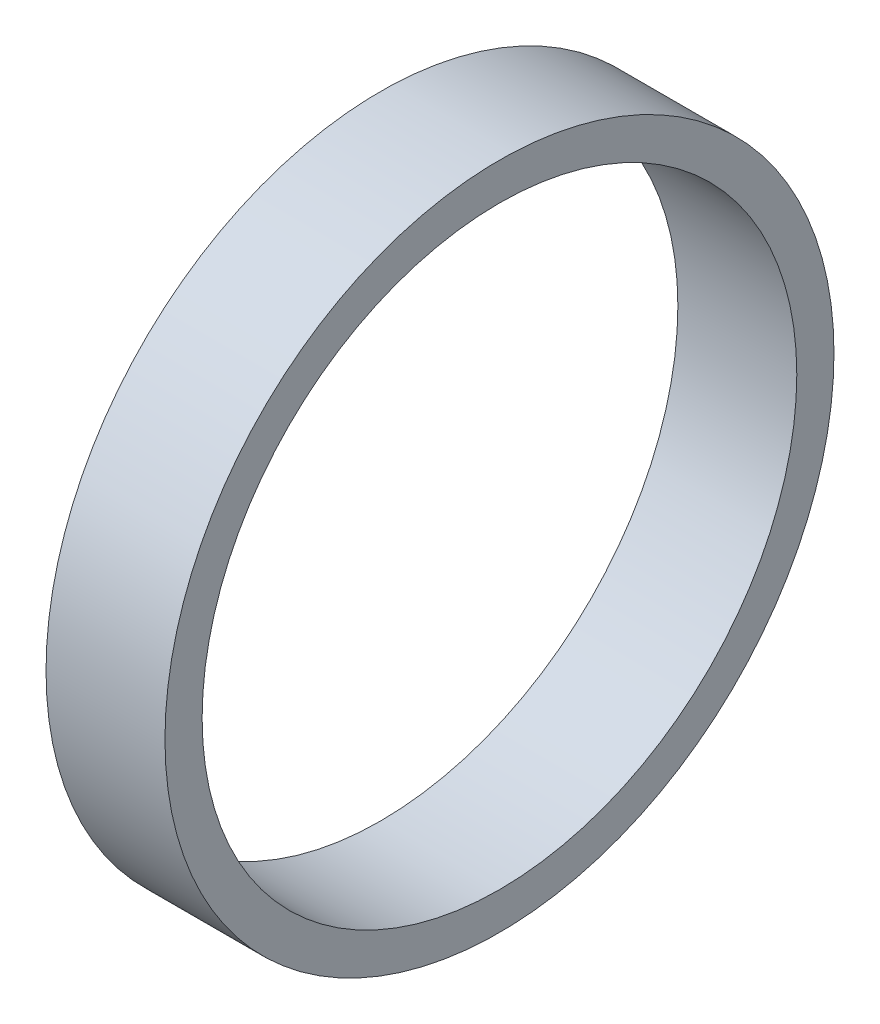
ISO-10303-21;
HEADER;
FILE_DESCRIPTION(('STEP AP214'),'2;1');
FILE_NAME('part.step','',(''),(''),'','','');
FILE_SCHEMA(('AUTOMOTIVE_DESIGN { 1 0 10303 214 1 1 1 1 }'));
ENDSEC;
DATA;
#1=APPLICATION_CONTEXT('core data for automotive mechanical design processes');
#2=APPLICATION_PROTOCOL_DEFINITION('international standard','automotive_design',2000,#1);
#3=PRODUCT_CONTEXT('',#1,'mechanical');
#4=PRODUCT('Part','Part','',(#3));
#5=PRODUCT_RELATED_PRODUCT_CATEGORY('part','',(#4));
#6=PRODUCT_DEFINITION_FORMATION('','',#4);
#7=PRODUCT_DEFINITION_CONTEXT('part definition',#1,'design');
#8=PRODUCT_DEFINITION('design','',#6,#7);
#9=PRODUCT_DEFINITION_SHAPE('','',#8);
#10=(LENGTH_UNIT() NAMED_UNIT(*) SI_UNIT(.MILLI.,.METRE.));
#11=(NAMED_UNIT(*) PLANE_ANGLE_UNIT() SI_UNIT($,.RADIAN.));
#12=(NAMED_UNIT(*) SI_UNIT($,.STERADIAN.) SOLID_ANGLE_UNIT());
#13=UNCERTAINTY_MEASURE_WITH_UNIT(LENGTH_MEASURE(1.E-05),#10,'distance_accuracy_value','');
#14=(GEOMETRIC_REPRESENTATION_CONTEXT(3) GLOBAL_UNCERTAINTY_ASSIGNED_CONTEXT((#13)) GLOBAL_UNIT_ASSIGNED_CONTEXT((#10,
#11,#12)) REPRESENTATION_CONTEXT('',''));
#15=CARTESIAN_POINT('',(0.,0.,0.));
#16=DIRECTION('',(0.,0.,1.));
#17=DIRECTION('',(1.,0.,0.));
#18=AXIS2_PLACEMENT_3D('',#15,#16,#17);
#19=CARTESIAN_POINT('',(5.08,0.,0.));
#20=DIRECTION('',(1.,0.,0.));
#21=DIRECTION('',(0.,0.,-1.));
#22=AXIS2_PLACEMENT_3D('',#19,#20,#21);
#23=PLANE('',#22);
#24=CARTESIAN_POINT('',(5.08,0.,0.));
#25=DIRECTION('',(1.,0.,0.));
#26=DIRECTION('',(0.,0.,-1.));
#27=AXIS2_PLACEMENT_3D('',#24,#25,#26);
#28=CIRCLE('',#27,14.2875);
#29=CARTESIAN_POINT('',(5.08,0.,-14.2875));
#30=VERTEX_POINT('',#29);
#31=EDGE_CURVE('E12',#30,#30,#28,.T.);
#32=ORIENTED_EDGE('',*,*,#31,.T.);
#33=EDGE_LOOP('',(#32));
#34=FACE_BOUND('',#33,.T.);
#35=CARTESIAN_POINT('',(5.08,0.,0.));
#36=DIRECTION('',(1.,0.,0.));
#37=DIRECTION('',(0.,0.,-1.));
#38=AXIS2_PLACEMENT_3D('',#35,#36,#37);
#39=CIRCLE('',#38,12.7);
#40=CARTESIAN_POINT('',(5.08,0.,-12.7));
#41=VERTEX_POINT('',#40);
#42=EDGE_CURVE('E56',#41,#41,#39,.T.);
#43=ORIENTED_EDGE('',*,*,#42,.F.);
#44=EDGE_LOOP('',(#43));
#45=FACE_BOUND('',#44,.T.);
#46=ADVANCED_FACE('F45',(#34,#45),#23,.T.);
#47=CARTESIAN_POINT('',(0.,0.,0.));
#48=DIRECTION('',(1.,0.,0.));
#49=DIRECTION('',(0.,0.,-1.));
#50=AXIS2_PLACEMENT_3D('',#47,#48,#49);
#51=PLANE('',#50);
#52=CARTESIAN_POINT('',(0.,0.,0.));
#53=DIRECTION('',(1.,0.,0.));
#54=DIRECTION('',(0.,0.,-1.));
#55=AXIS2_PLACEMENT_3D('',#52,#53,#54);
#56=CIRCLE('',#55,14.2875);
#57=CARTESIAN_POINT('',(0.,0.,-14.2875));
#58=VERTEX_POINT('',#57);
#59=EDGE_CURVE('E49',#58,#58,#56,.T.);
#60=ORIENTED_EDGE('',*,*,#59,.F.);
#61=EDGE_LOOP('',(#60));
#62=FACE_BOUND('',#61,.T.);
#63=CARTESIAN_POINT('',(0.,0.,0.));
#64=DIRECTION('',(1.,0.,0.));
#65=DIRECTION('',(0.,0.,-1.));
#66=AXIS2_PLACEMENT_3D('',#63,#64,#65);
#67=CIRCLE('',#66,12.7);
#68=CARTESIAN_POINT('',(0.,0.,-12.7));
#69=VERTEX_POINT('',#68);
#70=EDGE_CURVE('E58',#69,#69,#67,.T.);
#71=ORIENTED_EDGE('',*,*,#70,.T.);
#72=EDGE_LOOP('',(#71));
#73=FACE_BOUND('',#72,.T.);
#74=ADVANCED_FACE('F68',(#62,#73),#51,.F.);
#75=CARTESIAN_POINT('',(5.08,0.,0.));
#76=DIRECTION('',(-1.,0.,0.));
#77=DIRECTION('',(0.,0.,1.));
#78=AXIS2_PLACEMENT_3D('',#75,#76,#77);
#79=CYLINDRICAL_SURFACE('',#78,14.2875);
#80=ORIENTED_EDGE('',*,*,#31,.F.);
#81=EDGE_LOOP('',(#80));
#82=FACE_BOUND('',#81,.T.);
#83=ORIENTED_EDGE('',*,*,#59,.T.);
#84=EDGE_LOOP('',(#83));
#85=FACE_BOUND('',#84,.T.);
#86=ADVANCED_FACE('F47',(#82,#85),#79,.T.);
#87=CARTESIAN_POINT('',(5.08,0.,0.));
#88=DIRECTION('',(-1.,0.,0.));
#89=DIRECTION('',(0.,0.,1.));
#90=AXIS2_PLACEMENT_3D('',#87,#88,#89);
#91=CYLINDRICAL_SURFACE('',#90,12.7);
#92=ORIENTED_EDGE('',*,*,#42,.T.);
#93=EDGE_LOOP('',(#92));
#94=FACE_BOUND('',#93,.T.);
#95=ORIENTED_EDGE('',*,*,#70,.F.);
#96=EDGE_LOOP('',(#95));
#97=FACE_BOUND('',#96,.T.);
#98=ADVANCED_FACE('F64',(#94,#97),#91,.F.);
#99=CLOSED_SHELL('',(#46,#74,#86,#98));
#100=MANIFOLD_SOLID_BREP('B2',#99);
#101=ADVANCED_BREP_SHAPE_REPRESENTATION('',(#18,#100),#14);
#102=SHAPE_DEFINITION_REPRESENTATION(#9,#101);
ENDSEC;
END-ISO-10303-21;
